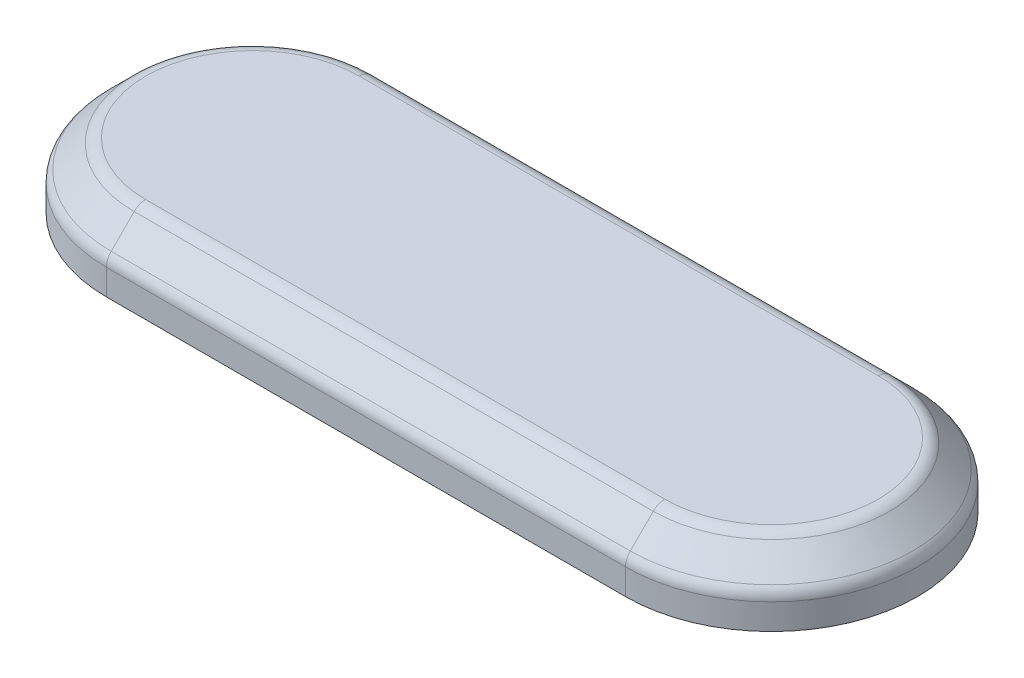
ISO-10303-21;
HEADER;
FILE_DESCRIPTION(('STEP AP214'),'2;1');
FILE_NAME('part.step','',(''),(''),'','','');
FILE_SCHEMA(('AUTOMOTIVE_DESIGN { 1 0 10303 214 1 1 1 1 }'));
ENDSEC;
DATA;
#1=APPLICATION_CONTEXT('core data for automotive mechanical design processes');
#2=APPLICATION_PROTOCOL_DEFINITION('international standard','automotive_design',2000,#1);
#3=PRODUCT_CONTEXT('',#1,'mechanical');
#4=PRODUCT('Part','Part','',(#3));
#5=PRODUCT_RELATED_PRODUCT_CATEGORY('part','',(#4));
#6=PRODUCT_DEFINITION_FORMATION('','',#4);
#7=PRODUCT_DEFINITION_CONTEXT('part definition',#1,'design');
#8=PRODUCT_DEFINITION('design','',#6,#7);
#9=PRODUCT_DEFINITION_SHAPE('','',#8);
#10=(LENGTH_UNIT() NAMED_UNIT(*) SI_UNIT(.MILLI.,.METRE.));
#11=(NAMED_UNIT(*) PLANE_ANGLE_UNIT() SI_UNIT($,.RADIAN.));
#12=(NAMED_UNIT(*) SI_UNIT($,.STERADIAN.) SOLID_ANGLE_UNIT());
#13=UNCERTAINTY_MEASURE_WITH_UNIT(LENGTH_MEASURE(1.E-05),#10,'distance_accuracy_value','');
#14=(GEOMETRIC_REPRESENTATION_CONTEXT(3) GLOBAL_UNCERTAINTY_ASSIGNED_CONTEXT((#13)) GLOBAL_UNIT_ASSIGNED_CONTEXT((#10,
#11,#12)) REPRESENTATION_CONTEXT('',''));
#15=CARTESIAN_POINT('',(0.,0.,0.));
#16=DIRECTION('',(0.,0.,1.));
#17=DIRECTION('',(1.,0.,0.));
#18=AXIS2_PLACEMENT_3D('',#15,#16,#17);
#19=CARTESIAN_POINT('',(-8.,2.,0.));
#20=DIRECTION('',(0.,-1.,0.));
#21=DIRECTION('',(0.,0.,-1.));
#22=AXIS2_PLACEMENT_3D('',#19,#20,#21);
#23=CYLINDRICAL_SURFACE('',#22,4.5);
#24=DIRECTION('',(0.,-1.,0.));
#25=VECTOR('',#24,1.);
#26=CARTESIAN_POINT('',(-8.,2.,4.5));
#27=LINE('',#26,#25);
#28=CARTESIAN_POINT('',(-8.,0.792893218813454,4.5));
#29=VERTEX_POINT('',#28);
#30=CARTESIAN_POINT('',(-8.,0.,4.5));
#31=VERTEX_POINT('',#30);
#32=EDGE_CURVE('E157',#29,#31,#27,.T.);
#33=ORIENTED_EDGE('',*,*,#32,.F.);
#34=CARTESIAN_POINT('',(-8.,0.792893218813454,0.));
#35=DIRECTION('',(0.,1.,0.));
#36=DIRECTION('',(0.,0.,1.));
#37=AXIS2_PLACEMENT_3D('',#34,#35,#36);
#38=CIRCLE('',#37,4.5);
#39=CARTESIAN_POINT('',(-8.,0.792893218813454,-4.5));
#40=VERTEX_POINT('',#39);
#41=EDGE_CURVE('E11',#29,#40,#38,.F.);
#42=ORIENTED_EDGE('',*,*,#41,.T.);
#43=DIRECTION('',(0.,-1.,0.));
#44=VECTOR('',#43,1.);
#45=CARTESIAN_POINT('',(-8.,2.,-4.5));
#46=LINE('',#45,#44);
#47=CARTESIAN_POINT('',(-8.,0.,-4.5));
#48=VERTEX_POINT('',#47);
#49=EDGE_CURVE('E151',#40,#48,#46,.T.);
#50=ORIENTED_EDGE('',*,*,#49,.T.);
#51=CARTESIAN_POINT('',(-8.,0.,0.));
#52=DIRECTION('',(0.,1.,0.));
#53=DIRECTION('',(0.,0.,1.));
#54=AXIS2_PLACEMENT_3D('',#51,#52,#53);
#55=CIRCLE('',#54,4.5);
#56=EDGE_CURVE('E139',#48,#31,#55,.T.);
#57=ORIENTED_EDGE('',*,*,#56,.T.);
#58=EDGE_LOOP('',(#33,#42,#50,#57));
#59=FACE_BOUND('',#58,.T.);
#60=ADVANCED_FACE('F35',(#59),#23,.T.);
#61=CARTESIAN_POINT('',(8.,2.,4.5));
#62=DIRECTION('',(0.,0.,-1.));
#63=DIRECTION('',(-1.,0.,0.));
#64=AXIS2_PLACEMENT_3D('',#61,#62,#63);
#65=PLANE('',#64);
#66=DIRECTION('',(0.,-1.,0.));
#67=VECTOR('',#66,1.);
#68=CARTESIAN_POINT('',(8.,2.,4.5));
#69=LINE('',#68,#67);
#70=CARTESIAN_POINT('',(8.,0.792893218813452,4.5));
#71=VERTEX_POINT('',#70);
#72=CARTESIAN_POINT('',(8.,0.,4.5));
#73=VERTEX_POINT('',#72);
#74=EDGE_CURVE('E155',#71,#73,#69,.T.);
#75=ORIENTED_EDGE('',*,*,#74,.F.);
#76=DIRECTION('',(-1.,0.,0.));
#77=VECTOR('',#76,1.);
#78=CARTESIAN_POINT('',(-8.,0.792893218813453,4.5));
#79=LINE('',#78,#77);
#80=EDGE_CURVE('E194',#71,#29,#79,.T.);
#81=ORIENTED_EDGE('',*,*,#80,.T.);
#82=ORIENTED_EDGE('',*,*,#32,.T.);
#83=DIRECTION('',(1.,0.,0.));
#84=VECTOR('',#83,1.);
#85=CARTESIAN_POINT('',(8.,0.,4.5));
#86=LINE('',#85,#84);
#87=EDGE_CURVE('E142',#31,#73,#86,.T.);
#88=ORIENTED_EDGE('',*,*,#87,.T.);
#89=EDGE_LOOP('',(#75,#81,#82,#88));
#90=FACE_BOUND('',#89,.T.);
#91=ADVANCED_FACE('F279',(#90),#65,.F.);
#92=CARTESIAN_POINT('',(8.,2.,0.));
#93=DIRECTION('',(0.,-1.,0.));
#94=DIRECTION('',(0.,0.,-1.));
#95=AXIS2_PLACEMENT_3D('',#92,#93,#94);
#96=CYLINDRICAL_SURFACE('',#95,4.5);
#97=DIRECTION('',(0.,-1.,0.));
#98=VECTOR('',#97,1.);
#99=CARTESIAN_POINT('',(8.,2.,-4.5));
#100=LINE('',#99,#98);
#101=CARTESIAN_POINT('',(8.,0.792893218813452,-4.5));
#102=VERTEX_POINT('',#101);
#103=CARTESIAN_POINT('',(8.,0.,-4.5));
#104=VERTEX_POINT('',#103);
#105=EDGE_CURVE('E153',#102,#104,#100,.T.);
#106=ORIENTED_EDGE('',*,*,#105,.F.);
#107=CARTESIAN_POINT('',(8.,0.792893218813452,0.));
#108=DIRECTION('',(0.,1.,0.));
#109=DIRECTION('',(0.,0.,1.));
#110=AXIS2_PLACEMENT_3D('',#107,#108,#109);
#111=CIRCLE('',#110,4.5);
#112=EDGE_CURVE('E197',#102,#71,#111,.F.);
#113=ORIENTED_EDGE('',*,*,#112,.T.);
#114=ORIENTED_EDGE('',*,*,#74,.T.);
#115=CARTESIAN_POINT('',(8.,0.,0.));
#116=DIRECTION('',(0.,1.,0.));
#117=DIRECTION('',(0.,0.,1.));
#118=AXIS2_PLACEMENT_3D('',#115,#116,#117);
#119=CIRCLE('',#118,4.5);
#120=EDGE_CURVE('E145',#73,#104,#119,.T.);
#121=ORIENTED_EDGE('',*,*,#120,.T.);
#122=EDGE_LOOP('',(#106,#113,#114,#121));
#123=FACE_BOUND('',#122,.T.);
#124=ADVANCED_FACE('F275',(#123),#96,.T.);
#125=CARTESIAN_POINT('',(8.,2.,-4.5));
#126=DIRECTION('',(0.,0.,1.));
#127=DIRECTION('',(1.,0.,0.));
#128=AXIS2_PLACEMENT_3D('',#125,#126,#127);
#129=PLANE('',#128);
#130=ORIENTED_EDGE('',*,*,#49,.F.);
#131=DIRECTION('',(1.,0.,0.));
#132=VECTOR('',#131,1.);
#133=CARTESIAN_POINT('',(8.,0.792893218813452,-4.5));
#134=LINE('',#133,#132);
#135=EDGE_CURVE('E57',#40,#102,#134,.T.);
#136=ORIENTED_EDGE('',*,*,#135,.T.);
#137=ORIENTED_EDGE('',*,*,#105,.T.);
#138=DIRECTION('',(-1.,0.,0.));
#139=VECTOR('',#138,1.);
#140=CARTESIAN_POINT('',(8.,0.,-4.5));
#141=LINE('',#140,#139);
#142=EDGE_CURVE('E148',#104,#48,#141,.T.);
#143=ORIENTED_EDGE('',*,*,#142,.T.);
#144=EDGE_LOOP('',(#130,#136,#137,#143));
#145=FACE_BOUND('',#144,.T.);
#146=ADVANCED_FACE('F266',(#145),#129,.F.);
#147=CARTESIAN_POINT('',(-8.,2.,0.));
#148=DIRECTION('',(0.,1.,0.));
#149=DIRECTION('',(0.,0.,1.));
#150=AXIS2_PLACEMENT_3D('',#147,#148,#149);
#151=PLANE('',#150);
#152=CARTESIAN_POINT('',(8.,2.,0.));
#153=DIRECTION('',(0.,1.,0.));
#154=DIRECTION('',(0.,0.,1.));
#155=AXIS2_PLACEMENT_3D('',#152,#153,#154);
#156=CIRCLE('',#155,3.29289321881346);
#157=CARTESIAN_POINT('',(8.,2.,3.29289321881345));
#158=VERTEX_POINT('',#157);
#159=CARTESIAN_POINT('',(8.,2.,-3.29289321881346));
#160=VERTEX_POINT('',#159);
#161=EDGE_CURVE('E175',#158,#160,#156,.T.);
#162=ORIENTED_EDGE('',*,*,#161,.T.);
#163=DIRECTION('',(-1.,0.,0.));
#164=VECTOR('',#163,1.);
#165=CARTESIAN_POINT('',(-8.,2.,-3.29289321881345));
#166=LINE('',#165,#164);
#167=CARTESIAN_POINT('',(-8.,2.,-3.29289321881345));
#168=VERTEX_POINT('',#167);
#169=EDGE_CURVE('E177',#160,#168,#166,.T.);
#170=ORIENTED_EDGE('',*,*,#169,.T.);
#171=CARTESIAN_POINT('',(-8.,2.,0.));
#172=DIRECTION('',(0.,1.,0.));
#173=DIRECTION('',(0.,0.,1.));
#174=AXIS2_PLACEMENT_3D('',#171,#172,#173);
#175=CIRCLE('',#174,3.29289321881346);
#176=CARTESIAN_POINT('',(-8.,2.,3.29289321881346));
#177=VERTEX_POINT('',#176);
#178=EDGE_CURVE('E159',#168,#177,#175,.T.);
#179=ORIENTED_EDGE('',*,*,#178,.T.);
#180=DIRECTION('',(1.,0.,0.));
#181=VECTOR('',#180,1.);
#182=CARTESIAN_POINT('',(-8.,2.,3.29289321881346));
#183=LINE('',#182,#181);
#184=EDGE_CURVE('E173',#177,#158,#183,.T.);
#185=ORIENTED_EDGE('',*,*,#184,.T.);
#186=EDGE_LOOP('',(#162,#170,#179,#185));
#187=FACE_BOUND('',#186,.T.);
#188=ADVANCED_FACE('F263',(#187),#151,.T.);
#189=CARTESIAN_POINT('',(-8.,0.,0.));
#190=DIRECTION('',(0.,1.,0.));
#191=DIRECTION('',(0.,0.,1.));
#192=AXIS2_PLACEMENT_3D('',#189,#190,#191);
#193=PLANE('',#192);
#194=CARTESIAN_POINT('',(-8.,0.,0.));
#195=DIRECTION('',(0.,-1.,0.));
#196=DIRECTION('',(0.,0.,-1.));
#197=AXIS2_PLACEMENT_3D('',#194,#195,#196);
#198=CIRCLE('',#197,1.25);
#199=CARTESIAN_POINT('',(-8.,0.,-1.25));
#200=VERTEX_POINT('',#199);
#201=EDGE_CURVE('E128',#200,#200,#198,.T.);
#202=ORIENTED_EDGE('',*,*,#201,.F.);
#203=EDGE_LOOP('',(#202));
#204=FACE_BOUND('',#203,.T.);
#205=CARTESIAN_POINT('',(8.,0.,0.));
#206=DIRECTION('',(0.,-1.,0.));
#207=DIRECTION('',(0.,0.,-1.));
#208=AXIS2_PLACEMENT_3D('',#205,#206,#207);
#209=CIRCLE('',#208,1.25);
#210=CARTESIAN_POINT('',(8.,0.,-1.25));
#211=VERTEX_POINT('',#210);
#212=EDGE_CURVE('E127',#211,#211,#209,.T.);
#213=ORIENTED_EDGE('',*,*,#212,.F.);
#214=EDGE_LOOP('',(#213));
#215=FACE_BOUND('',#214,.T.);
#216=ORIENTED_EDGE('',*,*,#56,.F.);
#217=ORIENTED_EDGE('',*,*,#142,.F.);
#218=ORIENTED_EDGE('',*,*,#120,.F.);
#219=ORIENTED_EDGE('',*,*,#87,.F.);
#220=EDGE_LOOP('',(#216,#217,#218,#219));
#221=FACE_BOUND('',#220,.T.);
#222=ADVANCED_FACE('F265',(#204,#215,#221),#193,.F.);
#223=CARTESIAN_POINT('',(8.,1.,0.));
#224=DIRECTION('',(0.,-1.,0.));
#225=DIRECTION('',(0.,0.,-1.));
#226=AXIS2_PLACEMENT_3D('',#223,#224,#225);
#227=CONICAL_SURFACE('',#226,1.25,1.02974425867665);
#228=CARTESIAN_POINT('',(8.,1.75107577378445,0.));
#229=VERTEX_POINT('',#228);
#230=VERTEX_LOOP('',#229);
#231=FACE_BOUND('',#230,.T.);
#232=CARTESIAN_POINT('',(8.,1.,0.));
#233=DIRECTION('',(0.,-1.,0.));
#234=DIRECTION('',(0.,0.,-1.));
#235=AXIS2_PLACEMENT_3D('',#232,#233,#234);
#236=CIRCLE('',#235,1.25);
#237=CARTESIAN_POINT('',(8.,1.,-1.25));
#238=VERTEX_POINT('',#237);
#239=EDGE_CURVE('E131',#238,#238,#236,.T.);
#240=ORIENTED_EDGE('',*,*,#239,.T.);
#241=EDGE_LOOP('',(#240));
#242=FACE_BOUND('',#241,.T.);
#243=ADVANCED_FACE('F272',(#231,#242),#227,.F.);
#244=CARTESIAN_POINT('',(8.,0.,0.));
#245=DIRECTION('',(0.,-1.,0.));
#246=DIRECTION('',(0.,0.,-1.));
#247=AXIS2_PLACEMENT_3D('',#244,#245,#246);
#248=CYLINDRICAL_SURFACE('',#247,1.25);
#249=ORIENTED_EDGE('',*,*,#239,.F.);
#250=EDGE_LOOP('',(#249));
#251=FACE_BOUND('',#250,.T.);
#252=ORIENTED_EDGE('',*,*,#212,.T.);
#253=EDGE_LOOP('',(#252));
#254=FACE_BOUND('',#253,.T.);
#255=ADVANCED_FACE('F121',(#251,#254),#248,.F.);
#256=CARTESIAN_POINT('',(-8.,1.,0.));
#257=DIRECTION('',(0.,-1.,0.));
#258=DIRECTION('',(0.,0.,-1.));
#259=AXIS2_PLACEMENT_3D('',#256,#257,#258);
#260=CONICAL_SURFACE('',#259,1.25,1.02974425867665);
#261=CARTESIAN_POINT('',(-8.,1.75107577378445,0.));
#262=VERTEX_POINT('',#261);
#263=VERTEX_LOOP('',#262);
#264=FACE_BOUND('',#263,.T.);
#265=CARTESIAN_POINT('',(-8.,1.,0.));
#266=DIRECTION('',(0.,-1.,0.));
#267=DIRECTION('',(0.,0.,-1.));
#268=AXIS2_PLACEMENT_3D('',#265,#266,#267);
#269=CIRCLE('',#268,1.25);
#270=CARTESIAN_POINT('',(-8.,1.,-1.25));
#271=VERTEX_POINT('',#270);
#272=EDGE_CURVE('E125',#271,#271,#269,.T.);
#273=ORIENTED_EDGE('',*,*,#272,.T.);
#274=EDGE_LOOP('',(#273));
#275=FACE_BOUND('',#274,.T.);
#276=ADVANCED_FACE('F117',(#264,#275),#260,.F.);
#277=CARTESIAN_POINT('',(-8.,0.,0.));
#278=DIRECTION('',(0.,-1.,0.));
#279=DIRECTION('',(0.,0.,-1.));
#280=AXIS2_PLACEMENT_3D('',#277,#278,#279);
#281=CYLINDRICAL_SURFACE('',#280,1.25);
#282=ORIENTED_EDGE('',*,*,#272,.F.);
#283=EDGE_LOOP('',(#282));
#284=FACE_BOUND('',#283,.T.);
#285=ORIENTED_EDGE('',*,*,#201,.T.);
#286=EDGE_LOOP('',(#285));
#287=FACE_BOUND('',#286,.T.);
#288=ADVANCED_FACE('F120',(#284,#287),#281,.F.);
#289=CARTESIAN_POINT('',(-8.,2.,3.5));
#290=DIRECTION('',(0.,0.707106781186546,0.707106781186549));
#291=DIRECTION('',(-1.,0.,0.));
#292=AXIS2_PLACEMENT_3D('',#289,#290,#291);
#293=PLANE('',#292);
#294=DIRECTION('',(0.,-0.707106781186549,0.707106781186546));
#295=VECTOR('',#294,1.);
#296=CARTESIAN_POINT('',(8.,2.,3.5));
#297=LINE('',#296,#295);
#298=CARTESIAN_POINT('',(8.,1.85355339059327,3.64644660940672));
#299=VERTEX_POINT('',#298);
#300=CARTESIAN_POINT('',(8.,1.14644660940672,4.35355339059327));
#301=VERTEX_POINT('',#300);
#302=EDGE_CURVE('E134',#299,#301,#297,.T.);
#303=ORIENTED_EDGE('',*,*,#302,.F.);
#304=DIRECTION('',(1.,0.,0.));
#305=VECTOR('',#304,1.);
#306=CARTESIAN_POINT('',(-8.,1.85355339059327,3.64644660940673));
#307=LINE('',#306,#305);
#308=CARTESIAN_POINT('',(-8.,1.85355339059327,3.64644660940673));
#309=VERTEX_POINT('',#308);
#310=EDGE_CURVE('E192',#299,#309,#307,.F.);
#311=ORIENTED_EDGE('',*,*,#310,.T.);
#312=DIRECTION('',(0.,0.707106781186549,-0.707106781186546));
#313=VECTOR('',#312,1.);
#314=CARTESIAN_POINT('',(-8.,0.999999999999999,4.5));
#315=LINE('',#314,#313);
#316=CARTESIAN_POINT('',(-8.,1.14644660940673,4.35355339059327));
#317=VERTEX_POINT('',#316);
#318=EDGE_CURVE('E167',#317,#309,#315,.T.);
#319=ORIENTED_EDGE('',*,*,#318,.F.);
#320=DIRECTION('',(-1.,0.,0.));
#321=VECTOR('',#320,1.);
#322=CARTESIAN_POINT('',(8.,1.14644660940673,4.35355339059327));
#323=LINE('',#322,#321);
#324=EDGE_CURVE('E189',#317,#301,#323,.F.);
#325=ORIENTED_EDGE('',*,*,#324,.T.);
#326=EDGE_LOOP('',(#303,#311,#319,#325));
#327=FACE_BOUND('',#326,.T.);
#328=ADVANCED_FACE('F253',(#327),#293,.T.);
#329=CARTESIAN_POINT('',(8.,2.,0.));
#330=DIRECTION('',(0.,-1.,0.));
#331=DIRECTION('',(0.,0.,-1.));
#332=AXIS2_PLACEMENT_3D('',#329,#330,#331);
#333=CONICAL_SURFACE('',#332,3.5,0.785398163397447);
#334=DIRECTION('',(0.,-0.707106781186549,-0.707106781186546));
#335=VECTOR('',#334,1.);
#336=CARTESIAN_POINT('',(8.,2.,-3.50000000000001));
#337=LINE('',#336,#335);
#338=CARTESIAN_POINT('',(8.,1.85355339059327,-3.64644660940673));
#339=VERTEX_POINT('',#338);
#340=CARTESIAN_POINT('',(8.,1.14644660940672,-4.35355339059328));
#341=VERTEX_POINT('',#340);
#342=EDGE_CURVE('E163',#339,#341,#337,.T.);
#343=ORIENTED_EDGE('',*,*,#342,.F.);
#344=CARTESIAN_POINT('',(8.,1.85355339059327,0.));
#345=DIRECTION('',(0.,1.,0.));
#346=DIRECTION('',(0.,0.,1.));
#347=AXIS2_PLACEMENT_3D('',#344,#345,#346);
#348=CIRCLE('',#347,3.64644660940673);
#349=EDGE_CURVE('E187',#339,#299,#348,.F.);
#350=ORIENTED_EDGE('',*,*,#349,.T.);
#351=ORIENTED_EDGE('',*,*,#302,.T.);
#352=CARTESIAN_POINT('',(8.,1.14644660940673,0.));
#353=DIRECTION('',(0.,-1.,0.));
#354=DIRECTION('',(0.,0.,-1.));
#355=AXIS2_PLACEMENT_3D('',#352,#353,#354);
#356=CIRCLE('',#355,4.35355339059327);
#357=EDGE_CURVE('E185',#301,#341,#356,.F.);
#358=ORIENTED_EDGE('',*,*,#357,.T.);
#359=EDGE_LOOP('',(#343,#350,#351,#358));
#360=FACE_BOUND('',#359,.T.);
#361=ADVANCED_FACE('F249',(#360),#333,.T.);
#362=CARTESIAN_POINT('',(-8.,2.,0.));
#363=DIRECTION('',(0.,-1.,0.));
#364=DIRECTION('',(0.,0.,-1.));
#365=AXIS2_PLACEMENT_3D('',#362,#363,#364);
#366=CONICAL_SURFACE('',#365,3.5,0.785398163397447);
#367=ORIENTED_EDGE('',*,*,#318,.T.);
#368=CARTESIAN_POINT('',(-8.,1.85355339059327,0.));
#369=DIRECTION('',(0.,1.,0.));
#370=DIRECTION('',(0.,0.,1.));
#371=AXIS2_PLACEMENT_3D('',#368,#369,#370);
#372=CIRCLE('',#371,3.64644660940673);
#373=CARTESIAN_POINT('',(-8.,1.85355339059327,-3.64644660940673));
#374=VERTEX_POINT('',#373);
#375=EDGE_CURVE('E44',#309,#374,#372,.F.);
#376=ORIENTED_EDGE('',*,*,#375,.T.);
#377=DIRECTION('',(0.,0.707106781186549,0.707106781186546));
#378=VECTOR('',#377,1.);
#379=CARTESIAN_POINT('',(-8.,0.999999999999999,-4.5));
#380=LINE('',#379,#378);
#381=CARTESIAN_POINT('',(-8.,1.14644660940673,-4.35355339059327));
#382=VERTEX_POINT('',#381);
#383=EDGE_CURVE('E160',#382,#374,#380,.T.);
#384=ORIENTED_EDGE('',*,*,#383,.F.);
#385=CARTESIAN_POINT('',(-8.,1.14644660940673,0.));
#386=DIRECTION('',(0.,-1.,0.));
#387=DIRECTION('',(0.,0.,-1.));
#388=AXIS2_PLACEMENT_3D('',#385,#386,#387);
#389=CIRCLE('',#388,4.35355339059327);
#390=EDGE_CURVE('E200',#382,#317,#389,.F.);
#391=ORIENTED_EDGE('',*,*,#390,.T.);
#392=EDGE_LOOP('',(#367,#376,#384,#391));
#393=FACE_BOUND('',#392,.T.);
#394=ADVANCED_FACE('F235',(#393),#366,.T.);
#395=CARTESIAN_POINT('',(-8.,2.,-3.5));
#396=DIRECTION('',(0.,0.707106781186546,-0.707106781186549));
#397=DIRECTION('',(1.,0.,0.));
#398=AXIS2_PLACEMENT_3D('',#395,#396,#397);
#399=PLANE('',#398);
#400=ORIENTED_EDGE('',*,*,#383,.T.);
#401=DIRECTION('',(-1.,0.,0.));
#402=VECTOR('',#401,1.);
#403=CARTESIAN_POINT('',(-8.,1.85355339059327,-3.64644660940673));
#404=LINE('',#403,#402);
#405=EDGE_CURVE('E182',#374,#339,#404,.F.);
#406=ORIENTED_EDGE('',*,*,#405,.T.);
#407=ORIENTED_EDGE('',*,*,#342,.T.);
#408=DIRECTION('',(1.,0.,0.));
#409=VECTOR('',#408,1.);
#410=CARTESIAN_POINT('',(-8.,1.14644660940672,-4.35355339059327));
#411=LINE('',#410,#409);
#412=EDGE_CURVE('E180',#341,#382,#411,.F.);
#413=ORIENTED_EDGE('',*,*,#412,.T.);
#414=EDGE_LOOP('',(#400,#406,#407,#413));
#415=FACE_BOUND('',#414,.T.);
#416=ADVANCED_FACE('F231',(#415),#399,.T.);
#417=CARTESIAN_POINT('',(-8.,1.5,3.29289321881346));
#418=DIRECTION('',(1.,0.,0.));
#419=DIRECTION('',(0.,0.,-1.));
#420=AXIS2_PLACEMENT_3D('',#417,#418,#419);
#421=CYLINDRICAL_SURFACE('',#420,0.5);
#422=CARTESIAN_POINT('',(-8.,1.5,3.29289321881346));
#423=DIRECTION('',(-1.,0.,0.));
#424=DIRECTION('',(0.,0.,1.));
#425=AXIS2_PLACEMENT_3D('',#422,#423,#424);
#426=CIRCLE('',#425,0.5);
#427=EDGE_CURVE('E207',#309,#177,#426,.T.);
#428=ORIENTED_EDGE('',*,*,#427,.F.);
#429=ORIENTED_EDGE('',*,*,#310,.F.);
#430=CARTESIAN_POINT('',(8.,1.5,3.29289321881345));
#431=DIRECTION('',(1.,0.,0.));
#432=DIRECTION('',(0.,0.,-1.));
#433=AXIS2_PLACEMENT_3D('',#430,#431,#432);
#434=CIRCLE('',#433,0.5);
#435=EDGE_CURVE('E164',#158,#299,#434,.T.);
#436=ORIENTED_EDGE('',*,*,#435,.F.);
#437=ORIENTED_EDGE('',*,*,#184,.F.);
#438=EDGE_LOOP('',(#428,#429,#436,#437));
#439=FACE_BOUND('',#438,.T.);
#440=ADVANCED_FACE('F257',(#439),#421,.T.);
#441=CARTESIAN_POINT('',(8.,1.5,0.));
#442=DIRECTION('',(0.,1.,0.));
#443=DIRECTION('',(0.,0.,1.));
#444=AXIS2_PLACEMENT_3D('',#441,#442,#443);
#445=TOROIDAL_SURFACE('',#444,3.29289321881346,0.5);
#446=ORIENTED_EDGE('',*,*,#435,.T.);
#447=ORIENTED_EDGE('',*,*,#349,.F.);
#448=CARTESIAN_POINT('',(8.,1.5,-3.29289321881346));
#449=DIRECTION('',(-1.,0.,0.));
#450=DIRECTION('',(0.,0.,1.));
#451=AXIS2_PLACEMENT_3D('',#448,#449,#450);
#452=CIRCLE('',#451,0.5);
#453=EDGE_CURVE('E205',#160,#339,#452,.T.);
#454=ORIENTED_EDGE('',*,*,#453,.F.);
#455=ORIENTED_EDGE('',*,*,#161,.F.);
#456=EDGE_LOOP('',(#446,#447,#454,#455));
#457=FACE_BOUND('',#456,.T.);
#458=ADVANCED_FACE('F261',(#457),#445,.T.);
#459=CARTESIAN_POINT('',(-8.,1.5,0.));
#460=DIRECTION('',(0.,1.,0.));
#461=DIRECTION('',(0.,0.,1.));
#462=AXIS2_PLACEMENT_3D('',#459,#460,#461);
#463=TOROIDAL_SURFACE('',#462,3.29289321881346,0.5);
#464=ORIENTED_EDGE('',*,*,#427,.T.);
#465=ORIENTED_EDGE('',*,*,#178,.F.);
#466=CARTESIAN_POINT('',(-8.,1.5,-3.29289321881345));
#467=DIRECTION('',(1.,0.,0.));
#468=DIRECTION('',(0.,0.,-1.));
#469=AXIS2_PLACEMENT_3D('',#466,#467,#468);
#470=CIRCLE('',#469,0.5);
#471=EDGE_CURVE('E203',#374,#168,#470,.T.);
#472=ORIENTED_EDGE('',*,*,#471,.F.);
#473=ORIENTED_EDGE('',*,*,#375,.F.);
#474=EDGE_LOOP('',(#464,#465,#472,#473));
#475=FACE_BOUND('',#474,.T.);
#476=ADVANCED_FACE('F241',(#475),#463,.T.);
#477=CARTESIAN_POINT('',(-8.,1.5,-3.29289321881345));
#478=DIRECTION('',(-1.,0.,0.));
#479=DIRECTION('',(0.,0.,1.));
#480=AXIS2_PLACEMENT_3D('',#477,#478,#479);
#481=CYLINDRICAL_SURFACE('',#480,0.5);
#482=ORIENTED_EDGE('',*,*,#453,.T.);
#483=ORIENTED_EDGE('',*,*,#405,.F.);
#484=ORIENTED_EDGE('',*,*,#471,.T.);
#485=ORIENTED_EDGE('',*,*,#169,.F.);
#486=EDGE_LOOP('',(#482,#483,#484,#485));
#487=FACE_BOUND('',#486,.T.);
#488=ADVANCED_FACE('F245',(#487),#481,.T.);
#489=CARTESIAN_POINT('',(8.,0.792893218813452,-4.00000000000001));
#490=DIRECTION('',(-1.,0.,0.));
#491=DIRECTION('',(0.,0.,1.));
#492=AXIS2_PLACEMENT_3D('',#489,#490,#491);
#493=CYLINDRICAL_SURFACE('',#492,0.5);
#494=CARTESIAN_POINT('',(-8.,0.792893218813452,-4.));
#495=DIRECTION('',(-1.,0.,0.));
#496=DIRECTION('',(0.,0.,1.));
#497=AXIS2_PLACEMENT_3D('',#494,#495,#496);
#498=CIRCLE('',#497,0.5);
#499=EDGE_CURVE('E215',#382,#40,#498,.T.);
#500=ORIENTED_EDGE('',*,*,#499,.F.);
#501=ORIENTED_EDGE('',*,*,#412,.F.);
#502=CARTESIAN_POINT('',(8.,0.792893218813452,-4.00000000000001));
#503=DIRECTION('',(1.,0.,0.));
#504=DIRECTION('',(0.,0.,-1.));
#505=AXIS2_PLACEMENT_3D('',#502,#503,#504);
#506=CIRCLE('',#505,0.5);
#507=EDGE_CURVE('E39',#102,#341,#506,.T.);
#508=ORIENTED_EDGE('',*,*,#507,.F.);
#509=ORIENTED_EDGE('',*,*,#135,.F.);
#510=EDGE_LOOP('',(#500,#501,#508,#509));
#511=FACE_BOUND('',#510,.T.);
#512=ADVANCED_FACE('F37',(#511),#493,.T.);
#513=CARTESIAN_POINT('',(8.,0.792893218813452,0.));
#514=DIRECTION('',(0.,1.,0.));
#515=DIRECTION('',(0.,0.,1.));
#516=AXIS2_PLACEMENT_3D('',#513,#514,#515);
#517=TOROIDAL_SURFACE('',#516,4.,0.5);
#518=ORIENTED_EDGE('',*,*,#507,.T.);
#519=ORIENTED_EDGE('',*,*,#357,.F.);
#520=CARTESIAN_POINT('',(8.,0.792893218813452,4.));
#521=DIRECTION('',(-1.,0.,0.));
#522=DIRECTION('',(0.,0.,1.));
#523=AXIS2_PLACEMENT_3D('',#520,#521,#522);
#524=CIRCLE('',#523,0.5);
#525=EDGE_CURVE('E214',#71,#301,#524,.T.);
#526=ORIENTED_EDGE('',*,*,#525,.F.);
#527=ORIENTED_EDGE('',*,*,#112,.F.);
#528=EDGE_LOOP('',(#518,#519,#526,#527));
#529=FACE_BOUND('',#528,.T.);
#530=ADVANCED_FACE('F225',(#529),#517,.T.);
#531=CARTESIAN_POINT('',(-8.,0.792893218813454,0.));
#532=DIRECTION('',(0.,1.,0.));
#533=DIRECTION('',(0.,0.,1.));
#534=AXIS2_PLACEMENT_3D('',#531,#532,#533);
#535=TOROIDAL_SURFACE('',#534,4.,0.5);
#536=ORIENTED_EDGE('',*,*,#499,.T.);
#537=ORIENTED_EDGE('',*,*,#41,.F.);
#538=CARTESIAN_POINT('',(-8.,0.792893218813453,4.));
#539=DIRECTION('',(1.,0.,0.));
#540=DIRECTION('',(0.,0.,-1.));
#541=AXIS2_PLACEMENT_3D('',#538,#539,#540);
#542=CIRCLE('',#541,0.5);
#543=EDGE_CURVE('E212',#317,#29,#542,.T.);
#544=ORIENTED_EDGE('',*,*,#543,.F.);
#545=ORIENTED_EDGE('',*,*,#390,.F.);
#546=EDGE_LOOP('',(#536,#537,#544,#545));
#547=FACE_BOUND('',#546,.T.);
#548=ADVANCED_FACE('F307',(#547),#535,.T.);
#549=CARTESIAN_POINT('',(8.,0.792893218813453,3.99999999999999));
#550=DIRECTION('',(1.,0.,0.));
#551=DIRECTION('',(0.,0.,-1.));
#552=AXIS2_PLACEMENT_3D('',#549,#550,#551);
#553=CYLINDRICAL_SURFACE('',#552,0.5);
#554=ORIENTED_EDGE('',*,*,#525,.T.);
#555=ORIENTED_EDGE('',*,*,#324,.F.);
#556=ORIENTED_EDGE('',*,*,#543,.T.);
#557=ORIENTED_EDGE('',*,*,#80,.F.);
#558=EDGE_LOOP('',(#554,#555,#556,#557));
#559=FACE_BOUND('',#558,.T.);
#560=ADVANCED_FACE('F304',(#559),#553,.T.);
#561=CLOSED_SHELL('',(#60,#91,#124,#146,#188,#222,#243,#255,#276,#288,#328,#361,#394,#416,#440,
#458,#476,#488,#512,#530,#548,#560));
#562=MANIFOLD_SOLID_BREP('B2',#561);
#563=ADVANCED_BREP_SHAPE_REPRESENTATION('',(#18,#562),#14);
#564=SHAPE_DEFINITION_REPRESENTATION(#9,#563);
ENDSEC;
END-ISO-10303-21;
